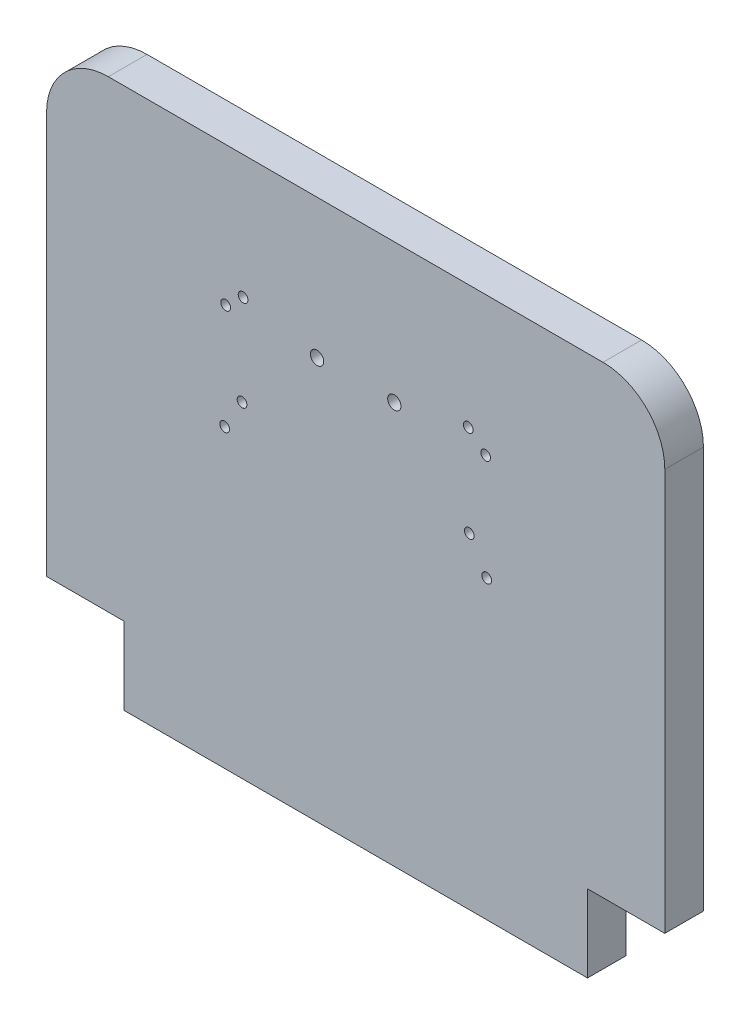
ISO-10303-21;
HEADER;
FILE_DESCRIPTION(('STEP AP214'),'2;1');
FILE_NAME('part.step','',(''),(''),'','','');
FILE_SCHEMA(('AUTOMOTIVE_DESIGN { 1 0 10303 214 1 1 1 1 }'));
ENDSEC;
DATA;
#1=APPLICATION_CONTEXT('core data for automotive mechanical design processes');
#2=APPLICATION_PROTOCOL_DEFINITION('international standard','automotive_design',2000,#1);
#3=PRODUCT_CONTEXT('',#1,'mechanical');
#4=PRODUCT('Part','Part','',(#3));
#5=PRODUCT_RELATED_PRODUCT_CATEGORY('part','',(#4));
#6=PRODUCT_DEFINITION_FORMATION('','',#4);
#7=PRODUCT_DEFINITION_CONTEXT('part definition',#1,'design');
#8=PRODUCT_DEFINITION('design','',#6,#7);
#9=PRODUCT_DEFINITION_SHAPE('','',#8);
#10=(LENGTH_UNIT() NAMED_UNIT(*) SI_UNIT(.MILLI.,.METRE.));
#11=(NAMED_UNIT(*) PLANE_ANGLE_UNIT() SI_UNIT($,.RADIAN.));
#12=(NAMED_UNIT(*) SI_UNIT($,.STERADIAN.) SOLID_ANGLE_UNIT());
#13=UNCERTAINTY_MEASURE_WITH_UNIT(LENGTH_MEASURE(1.E-05),#10,'distance_accuracy_value','');
#14=(GEOMETRIC_REPRESENTATION_CONTEXT(3) GLOBAL_UNCERTAINTY_ASSIGNED_CONTEXT((#13)) GLOBAL_UNIT_ASSIGNED_CONTEXT((#10,
#11,#12)) REPRESENTATION_CONTEXT('',''));
#15=CARTESIAN_POINT('',(0.,0.,0.));
#16=DIRECTION('',(0.,0.,1.));
#17=DIRECTION('',(1.,0.,0.));
#18=AXIS2_PLACEMENT_3D('',#15,#16,#17);
#19=CARTESIAN_POINT('',(0.,0.,6.35));
#20=DIRECTION('',(0.,0.,-1.));
#21=DIRECTION('',(-1.,0.,0.));
#22=AXIS2_PLACEMENT_3D('',#19,#20,#21);
#23=PLANE('',#22);
#24=DIRECTION('',(0.,1.,0.));
#25=VECTOR('',#24,1.);
#26=CARTESIAN_POINT('',(101.6,0.,6.35));
#27=LINE('',#26,#25);
#28=CARTESIAN_POINT('',(101.6,0.,6.35));
#29=VERTEX_POINT('',#28);
#30=CARTESIAN_POINT('',(101.6,66.04,6.35));
#31=VERTEX_POINT('',#30);
#32=EDGE_CURVE('E169',#29,#31,#27,.T.);
#33=ORIENTED_EDGE('',*,*,#32,.T.);
#34=CARTESIAN_POINT('',(91.44,66.04,6.35));
#35=DIRECTION('',(0.,0.,-1.));
#36=DIRECTION('',(-1.,0.,0.));
#37=AXIS2_PLACEMENT_3D('',#34,#35,#36);
#38=CIRCLE('',#37,10.16);
#39=CARTESIAN_POINT('',(91.44,76.2,6.35));
#40=VERTEX_POINT('',#39);
#41=EDGE_CURVE('E48',#31,#40,#38,.F.);
#42=ORIENTED_EDGE('',*,*,#41,.T.);
#43=DIRECTION('',(-1.,0.,0.));
#44=VECTOR('',#43,1.);
#45=CARTESIAN_POINT('',(0.,76.2,6.35));
#46=LINE('',#45,#44);
#47=CARTESIAN_POINT('',(10.16,76.2,6.35));
#48=VERTEX_POINT('',#47);
#49=EDGE_CURVE('E168',#40,#48,#46,.T.);
#50=ORIENTED_EDGE('',*,*,#49,.T.);
#51=CARTESIAN_POINT('',(10.16,66.04,6.35));
#52=DIRECTION('',(0.,0.,-1.));
#53=DIRECTION('',(-1.,0.,0.));
#54=AXIS2_PLACEMENT_3D('',#51,#52,#53);
#55=CIRCLE('',#54,10.16);
#56=CARTESIAN_POINT('',(0.,66.04,6.35));
#57=VERTEX_POINT('',#56);
#58=EDGE_CURVE('E55',#48,#57,#55,.F.);
#59=ORIENTED_EDGE('',*,*,#58,.T.);
#60=DIRECTION('',(0.,-1.,0.));
#61=VECTOR('',#60,1.);
#62=CARTESIAN_POINT('',(0.,0.,6.35));
#63=LINE('',#62,#61);
#64=CARTESIAN_POINT('',(0.,0.,6.35));
#65=VERTEX_POINT('',#64);
#66=EDGE_CURVE('E117',#57,#65,#63,.T.);
#67=ORIENTED_EDGE('',*,*,#66,.T.);
#68=DIRECTION('',(1.,0.,0.));
#69=VECTOR('',#68,1.);
#70=CARTESIAN_POINT('',(0.,0.,6.35));
#71=LINE('',#70,#69);
#72=CARTESIAN_POINT('',(12.7,0.,6.35));
#73=VERTEX_POINT('',#72);
#74=EDGE_CURVE('E120',#65,#73,#71,.T.);
#75=ORIENTED_EDGE('',*,*,#74,.T.);
#76=DIRECTION('',(0.,-1.,0.));
#77=VECTOR('',#76,1.);
#78=CARTESIAN_POINT('',(12.7,0.,6.35));
#79=LINE('',#78,#77);
#80=CARTESIAN_POINT('',(12.7,-12.7,6.35));
#81=VERTEX_POINT('',#80);
#82=EDGE_CURVE('E136',#73,#81,#79,.T.);
#83=ORIENTED_EDGE('',*,*,#82,.T.);
#84=DIRECTION('',(1.,0.,0.));
#85=VECTOR('',#84,1.);
#86=CARTESIAN_POINT('',(12.7,-12.7,6.35));
#87=LINE('',#86,#85);
#88=CARTESIAN_POINT('',(88.9,-12.7,6.35));
#89=VERTEX_POINT('',#88);
#90=EDGE_CURVE('E218',#81,#89,#87,.T.);
#91=ORIENTED_EDGE('',*,*,#90,.T.);
#92=DIRECTION('',(0.,1.,0.));
#93=VECTOR('',#92,1.);
#94=CARTESIAN_POINT('',(88.9,0.,6.35));
#95=LINE('',#94,#93);
#96=CARTESIAN_POINT('',(88.9,0.,6.35));
#97=VERTEX_POINT('',#96);
#98=EDGE_CURVE('E240',#89,#97,#95,.T.);
#99=ORIENTED_EDGE('',*,*,#98,.T.);
#100=DIRECTION('',(1.,0.,0.));
#101=VECTOR('',#100,1.);
#102=CARTESIAN_POINT('',(88.9,0.,6.35));
#103=LINE('',#102,#101);
#104=EDGE_CURVE('E237',#97,#29,#103,.T.);
#105=ORIENTED_EDGE('',*,*,#104,.T.);
#106=EDGE_LOOP('',(#33,#42,#50,#59,#67,#75,#83,#91,#99,#105));
#107=FACE_BOUND('',#106,.T.);
#108=CARTESIAN_POINT('',(44.45,53.34,6.35));
#109=DIRECTION('',(0.,0.,1.));
#110=DIRECTION('',(1.,0.,0.));
#111=AXIS2_PLACEMENT_3D('',#108,#109,#110);
#112=CIRCLE('',#111,1.0922);
#113=CARTESIAN_POINT('',(45.5422,53.34,6.35));
#114=VERTEX_POINT('',#113);
#115=EDGE_CURVE('E233',#114,#114,#112,.T.);
#116=ORIENTED_EDGE('',*,*,#115,.F.);
#117=EDGE_LOOP('',(#116));
#118=FACE_BOUND('',#117,.T.);
#119=CARTESIAN_POINT('',(57.15,53.34,6.35));
#120=DIRECTION('',(0.,0.,1.));
#121=DIRECTION('',(-1.,0.,0.));
#122=AXIS2_PLACEMENT_3D('',#119,#120,#121);
#123=CIRCLE('',#122,1.09220000000001);
#124=CARTESIAN_POINT('',(56.0578,53.34,6.35));
#125=VERTEX_POINT('',#124);
#126=EDGE_CURVE('E251',#125,#125,#123,.T.);
#127=ORIENTED_EDGE('',*,*,#126,.F.);
#128=EDGE_LOOP('',(#127));
#129=FACE_BOUND('',#128,.T.);
#130=CARTESIAN_POINT('',(32.3,55.88,6.35));
#131=DIRECTION('',(0.,0.,1.));
#132=DIRECTION('',(1.,0.,0.));
#133=AXIS2_PLACEMENT_3D('',#130,#131,#132);
#134=CIRCLE('',#133,0.799999999800007);
#135=CARTESIAN_POINT('',(33.0999999998,55.88,6.35));
#136=VERTEX_POINT('',#135);
#137=EDGE_CURVE('E259',#136,#136,#134,.T.);
#138=ORIENTED_EDGE('',*,*,#137,.F.);
#139=EDGE_LOOP('',(#138));
#140=FACE_BOUND('',#139,.T.);
#141=CARTESIAN_POINT('',(69.3,55.88,6.35));
#142=DIRECTION('',(0.,0.,1.));
#143=DIRECTION('',(-1.,0.,0.));
#144=AXIS2_PLACEMENT_3D('',#141,#142,#143);
#145=CIRCLE('',#144,0.79999999980002);
#146=CARTESIAN_POINT('',(68.5000000002,55.88,6.35));
#147=VERTEX_POINT('',#146);
#148=EDGE_CURVE('E267',#147,#147,#145,.T.);
#149=ORIENTED_EDGE('',*,*,#148,.F.);
#150=EDGE_LOOP('',(#149));
#151=FACE_BOUND('',#150,.T.);
#152=CARTESIAN_POINT('',(32.12531161866,40.88,6.35));
#153=DIRECTION('',(0.,0.,1.));
#154=DIRECTION('',(1.,0.,0.));
#155=AXIS2_PLACEMENT_3D('',#152,#153,#154);
#156=CIRCLE('',#155,0.799999999800007);
#157=CARTESIAN_POINT('',(32.92531161846,40.88,6.35));
#158=VERTEX_POINT('',#157);
#159=EDGE_CURVE('E275',#158,#158,#156,.T.);
#160=ORIENTED_EDGE('',*,*,#159,.F.);
#161=EDGE_LOOP('',(#160));
#162=FACE_BOUND('',#161,.T.);
#163=CARTESIAN_POINT('',(69.47468838134,40.88,6.35));
#164=DIRECTION('',(0.,0.,1.));
#165=DIRECTION('',(-1.,0.,0.));
#166=AXIS2_PLACEMENT_3D('',#163,#164,#165);
#167=CIRCLE('',#166,0.799999999800036);
#168=CARTESIAN_POINT('',(68.67468838154,40.88,6.35));
#169=VERTEX_POINT('',#168);
#170=EDGE_CURVE('E283',#169,#169,#167,.T.);
#171=ORIENTED_EDGE('',*,*,#170,.F.);
#172=EDGE_LOOP('',(#171));
#173=FACE_BOUND('',#172,.T.);
#174=CARTESIAN_POINT('',(29.4386,53.34,6.35));
#175=DIRECTION('',(0.,0.,1.));
#176=DIRECTION('',(1.,0.,0.));
#177=AXIS2_PLACEMENT_3D('',#174,#175,#176);
#178=CIRCLE('',#177,0.799999999800007);
#179=CARTESIAN_POINT('',(30.2385999998,53.34,6.35));
#180=VERTEX_POINT('',#179);
#181=EDGE_CURVE('E291',#180,#180,#178,.T.);
#182=ORIENTED_EDGE('',*,*,#181,.F.);
#183=EDGE_LOOP('',(#182));
#184=FACE_BOUND('',#183,.T.);
#185=CARTESIAN_POINT('',(29.26391161866,35.9540048,6.35));
#186=DIRECTION('',(0.,0.,1.));
#187=DIRECTION('',(1.,0.,0.));
#188=AXIS2_PLACEMENT_3D('',#185,#186,#187);
#189=CIRCLE('',#188,0.799999999800007);
#190=CARTESIAN_POINT('',(30.06391161846,35.9540048,6.35));
#191=VERTEX_POINT('',#190);
#192=EDGE_CURVE('E299',#191,#191,#189,.T.);
#193=ORIENTED_EDGE('',*,*,#192,.F.);
#194=EDGE_LOOP('',(#193));
#195=FACE_BOUND('',#194,.T.);
#196=CARTESIAN_POINT('',(72.33608838134,35.9540048,6.35));
#197=DIRECTION('',(0.,0.,1.));
#198=DIRECTION('',(-1.,0.,0.));
#199=AXIS2_PLACEMENT_3D('',#196,#197,#198);
#200=CIRCLE('',#199,0.799999999800007);
#201=CARTESIAN_POINT('',(71.53608838154,35.9540048,6.35));
#202=VERTEX_POINT('',#201);
#203=EDGE_CURVE('E307',#202,#202,#200,.T.);
#204=ORIENTED_EDGE('',*,*,#203,.F.);
#205=EDGE_LOOP('',(#204));
#206=FACE_BOUND('',#205,.T.);
#207=CARTESIAN_POINT('',(72.1614,53.34,6.35));
#208=DIRECTION('',(0.,0.,1.));
#209=DIRECTION('',(-1.,0.,0.));
#210=AXIS2_PLACEMENT_3D('',#207,#208,#209);
#211=CIRCLE('',#210,0.799999999800007);
#212=CARTESIAN_POINT('',(71.3614000002,53.34,6.35));
#213=VERTEX_POINT('',#212);
#214=EDGE_CURVE('E315',#213,#213,#211,.T.);
#215=ORIENTED_EDGE('',*,*,#214,.F.);
#216=EDGE_LOOP('',(#215));
#217=FACE_BOUND('',#216,.T.);
#218=ADVANCED_FACE('F39',(#107,#118,#129,#140,#151,#162,#173,#184,#195,#206,#217),#23,.F.);
#219=CARTESIAN_POINT('',(0.,0.,0.));
#220=DIRECTION('',(0.,0.,-1.));
#221=DIRECTION('',(-1.,0.,0.));
#222=AXIS2_PLACEMENT_3D('',#219,#220,#221);
#223=PLANE('',#222);
#224=CARTESIAN_POINT('',(72.33608838134,35.9540048,0.));
#225=DIRECTION('',(0.,0.,1.));
#226=DIRECTION('',(-1.,0.,0.));
#227=AXIS2_PLACEMENT_3D('',#224,#225,#226);
#228=CIRCLE('',#227,0.799999999800007);
#229=CARTESIAN_POINT('',(71.53608838154,35.9540048,0.));
#230=VERTEX_POINT('',#229);
#231=EDGE_CURVE('E311',#230,#230,#228,.T.);
#232=ORIENTED_EDGE('',*,*,#231,.T.);
#233=EDGE_LOOP('',(#232));
#234=FACE_BOUND('',#233,.T.);
#235=CARTESIAN_POINT('',(29.4386,53.34,0.));
#236=DIRECTION('',(0.,0.,1.));
#237=DIRECTION('',(1.,0.,0.));
#238=AXIS2_PLACEMENT_3D('',#235,#236,#237);
#239=CIRCLE('',#238,0.799999999800007);
#240=CARTESIAN_POINT('',(30.2385999998,53.34,0.));
#241=VERTEX_POINT('',#240);
#242=EDGE_CURVE('E295',#241,#241,#239,.T.);
#243=ORIENTED_EDGE('',*,*,#242,.T.);
#244=EDGE_LOOP('',(#243));
#245=FACE_BOUND('',#244,.T.);
#246=CARTESIAN_POINT('',(32.12531161866,40.88,0.));
#247=DIRECTION('',(0.,0.,1.));
#248=DIRECTION('',(1.,0.,0.));
#249=AXIS2_PLACEMENT_3D('',#246,#247,#248);
#250=CIRCLE('',#249,0.799999999800007);
#251=CARTESIAN_POINT('',(32.92531161846,40.88,0.));
#252=VERTEX_POINT('',#251);
#253=EDGE_CURVE('E279',#252,#252,#250,.T.);
#254=ORIENTED_EDGE('',*,*,#253,.T.);
#255=EDGE_LOOP('',(#254));
#256=FACE_BOUND('',#255,.T.);
#257=CARTESIAN_POINT('',(32.3,55.88,0.));
#258=DIRECTION('',(0.,0.,1.));
#259=DIRECTION('',(1.,0.,0.));
#260=AXIS2_PLACEMENT_3D('',#257,#258,#259);
#261=CIRCLE('',#260,0.799999999800007);
#262=CARTESIAN_POINT('',(33.0999999998,55.88,0.));
#263=VERTEX_POINT('',#262);
#264=EDGE_CURVE('E263',#263,#263,#261,.T.);
#265=ORIENTED_EDGE('',*,*,#264,.T.);
#266=EDGE_LOOP('',(#265));
#267=FACE_BOUND('',#266,.T.);
#268=CARTESIAN_POINT('',(44.45,53.34,0.));
#269=DIRECTION('',(0.,0.,1.));
#270=DIRECTION('',(1.,0.,0.));
#271=AXIS2_PLACEMENT_3D('',#268,#269,#270);
#272=CIRCLE('',#271,1.0922);
#273=CARTESIAN_POINT('',(45.5422,53.34,0.));
#274=VERTEX_POINT('',#273);
#275=EDGE_CURVE('E247',#274,#274,#272,.T.);
#276=ORIENTED_EDGE('',*,*,#275,.T.);
#277=EDGE_LOOP('',(#276));
#278=FACE_BOUND('',#277,.T.);
#279=DIRECTION('',(-1.,0.,0.));
#280=VECTOR('',#279,1.);
#281=CARTESIAN_POINT('',(0.,76.2,0.));
#282=LINE('',#281,#280);
#283=CARTESIAN_POINT('',(91.44,76.2,0.));
#284=VERTEX_POINT('',#283);
#285=CARTESIAN_POINT('',(10.16,76.2,0.));
#286=VERTEX_POINT('',#285);
#287=EDGE_CURVE('E126',#284,#286,#282,.T.);
#288=ORIENTED_EDGE('',*,*,#287,.F.);
#289=CARTESIAN_POINT('',(91.44,66.04,0.));
#290=DIRECTION('',(0.,0.,-1.));
#291=DIRECTION('',(-1.,0.,0.));
#292=AXIS2_PLACEMENT_3D('',#289,#290,#291);
#293=CIRCLE('',#292,10.16);
#294=CARTESIAN_POINT('',(101.6,66.04,0.));
#295=VERTEX_POINT('',#294);
#296=EDGE_CURVE('E159',#284,#295,#293,.T.);
#297=ORIENTED_EDGE('',*,*,#296,.T.);
#298=DIRECTION('',(0.,1.,0.));
#299=VECTOR('',#298,1.);
#300=CARTESIAN_POINT('',(101.6,0.,0.));
#301=LINE('',#300,#299);
#302=CARTESIAN_POINT('',(101.6,0.,0.));
#303=VERTEX_POINT('',#302);
#304=EDGE_CURVE('E186',#303,#295,#301,.T.);
#305=ORIENTED_EDGE('',*,*,#304,.F.);
#306=DIRECTION('',(1.,0.,0.));
#307=VECTOR('',#306,1.);
#308=CARTESIAN_POINT('',(88.9,0.,0.));
#309=LINE('',#308,#307);
#310=CARTESIAN_POINT('',(88.9,0.,0.));
#311=VERTEX_POINT('',#310);
#312=EDGE_CURVE('E191',#311,#303,#309,.T.);
#313=ORIENTED_EDGE('',*,*,#312,.F.);
#314=DIRECTION('',(0.,1.,0.));
#315=VECTOR('',#314,1.);
#316=CARTESIAN_POINT('',(88.9,0.,0.));
#317=LINE('',#316,#315);
#318=CARTESIAN_POINT('',(88.9,-12.7,0.));
#319=VERTEX_POINT('',#318);
#320=EDGE_CURVE('E196',#319,#311,#317,.T.);
#321=ORIENTED_EDGE('',*,*,#320,.F.);
#322=DIRECTION('',(1.,0.,0.));
#323=VECTOR('',#322,1.);
#324=CARTESIAN_POINT('',(12.7,-12.7,0.));
#325=LINE('',#324,#323);
#326=CARTESIAN_POINT('',(12.7,-12.7,0.));
#327=VERTEX_POINT('',#326);
#328=EDGE_CURVE('E217',#327,#319,#325,.T.);
#329=ORIENTED_EDGE('',*,*,#328,.F.);
#330=DIRECTION('',(0.,-1.,0.));
#331=VECTOR('',#330,1.);
#332=CARTESIAN_POINT('',(12.7,0.,0.));
#333=LINE('',#332,#331);
#334=CARTESIAN_POINT('',(12.7,0.,0.));
#335=VERTEX_POINT('',#334);
#336=EDGE_CURVE('E222',#335,#327,#333,.T.);
#337=ORIENTED_EDGE('',*,*,#336,.F.);
#338=DIRECTION('',(1.,0.,0.));
#339=VECTOR('',#338,1.);
#340=CARTESIAN_POINT('',(0.,0.,0.));
#341=LINE('',#340,#339);
#342=CARTESIAN_POINT('',(0.,0.,0.));
#343=VERTEX_POINT('',#342);
#344=EDGE_CURVE('E227',#343,#335,#341,.T.);
#345=ORIENTED_EDGE('',*,*,#344,.F.);
#346=DIRECTION('',(0.,-1.,0.));
#347=VECTOR('',#346,1.);
#348=CARTESIAN_POINT('',(0.,0.,0.));
#349=LINE('',#348,#347);
#350=CARTESIAN_POINT('',(0.,66.04,0.));
#351=VERTEX_POINT('',#350);
#352=EDGE_CURVE('E140',#351,#343,#349,.T.);
#353=ORIENTED_EDGE('',*,*,#352,.F.);
#354=CARTESIAN_POINT('',(10.16,66.04,0.));
#355=DIRECTION('',(0.,0.,-1.));
#356=DIRECTION('',(-1.,0.,0.));
#357=AXIS2_PLACEMENT_3D('',#354,#355,#356);
#358=CIRCLE('',#357,10.16);
#359=EDGE_CURVE('E156',#351,#286,#358,.T.);
#360=ORIENTED_EDGE('',*,*,#359,.T.);
#361=EDGE_LOOP('',(#288,#297,#305,#313,#321,#329,#337,#345,#353,#360));
#362=FACE_BOUND('',#361,.T.);
#363=CARTESIAN_POINT('',(57.15,53.34,0.));
#364=DIRECTION('',(0.,0.,1.));
#365=DIRECTION('',(-1.,0.,0.));
#366=AXIS2_PLACEMENT_3D('',#363,#364,#365);
#367=CIRCLE('',#366,1.09220000000001);
#368=CARTESIAN_POINT('',(56.0578,53.34,0.));
#369=VERTEX_POINT('',#368);
#370=EDGE_CURVE('E255',#369,#369,#367,.T.);
#371=ORIENTED_EDGE('',*,*,#370,.T.);
#372=EDGE_LOOP('',(#371));
#373=FACE_BOUND('',#372,.T.);
#374=CARTESIAN_POINT('',(69.3,55.88,0.));
#375=DIRECTION('',(0.,0.,1.));
#376=DIRECTION('',(-1.,0.,0.));
#377=AXIS2_PLACEMENT_3D('',#374,#375,#376);
#378=CIRCLE('',#377,0.79999999980002);
#379=CARTESIAN_POINT('',(68.5000000002,55.88,0.));
#380=VERTEX_POINT('',#379);
#381=EDGE_CURVE('E271',#380,#380,#378,.T.);
#382=ORIENTED_EDGE('',*,*,#381,.T.);
#383=EDGE_LOOP('',(#382));
#384=FACE_BOUND('',#383,.T.);
#385=CARTESIAN_POINT('',(69.47468838134,40.88,0.));
#386=DIRECTION('',(0.,0.,1.));
#387=DIRECTION('',(-1.,0.,0.));
#388=AXIS2_PLACEMENT_3D('',#385,#386,#387);
#389=CIRCLE('',#388,0.799999999800036);
#390=CARTESIAN_POINT('',(68.67468838154,40.88,0.));
#391=VERTEX_POINT('',#390);
#392=EDGE_CURVE('E287',#391,#391,#389,.T.);
#393=ORIENTED_EDGE('',*,*,#392,.T.);
#394=EDGE_LOOP('',(#393));
#395=FACE_BOUND('',#394,.T.);
#396=CARTESIAN_POINT('',(29.26391161866,35.9540048,0.));
#397=DIRECTION('',(0.,0.,1.));
#398=DIRECTION('',(1.,0.,0.));
#399=AXIS2_PLACEMENT_3D('',#396,#397,#398);
#400=CIRCLE('',#399,0.799999999800007);
#401=CARTESIAN_POINT('',(30.06391161846,35.9540048,0.));
#402=VERTEX_POINT('',#401);
#403=EDGE_CURVE('E303',#402,#402,#400,.T.);
#404=ORIENTED_EDGE('',*,*,#403,.T.);
#405=EDGE_LOOP('',(#404));
#406=FACE_BOUND('',#405,.T.);
#407=CARTESIAN_POINT('',(72.1614,53.34,0.));
#408=DIRECTION('',(0.,0.,1.));
#409=DIRECTION('',(-1.,0.,0.));
#410=AXIS2_PLACEMENT_3D('',#407,#408,#409);
#411=CIRCLE('',#410,0.799999999800007);
#412=CARTESIAN_POINT('',(71.3614000002,53.34,0.));
#413=VERTEX_POINT('',#412);
#414=EDGE_CURVE('E319',#413,#413,#411,.T.);
#415=ORIENTED_EDGE('',*,*,#414,.T.);
#416=EDGE_LOOP('',(#415));
#417=FACE_BOUND('',#416,.T.);
#418=ADVANCED_FACE('F183',(#234,#245,#256,#267,#278,#362,#373,#384,#395,#406,#417),#223,.T.);
#419=CARTESIAN_POINT('',(0.,0.,6.35));
#420=DIRECTION('',(1.,0.,0.));
#421=DIRECTION('',(0.,0.,-1.));
#422=AXIS2_PLACEMENT_3D('',#419,#420,#421);
#423=PLANE('',#422);
#424=ORIENTED_EDGE('',*,*,#66,.F.);
#425=DIRECTION('',(0.,0.,-1.));
#426=VECTOR('',#425,1.);
#427=CARTESIAN_POINT('',(0.,66.04,6.35));
#428=LINE('',#427,#426);
#429=EDGE_CURVE('E11',#57,#351,#428,.T.);
#430=ORIENTED_EDGE('',*,*,#429,.T.);
#431=ORIENTED_EDGE('',*,*,#352,.T.);
#432=DIRECTION('',(0.,0.,-1.));
#433=VECTOR('',#432,1.);
#434=CARTESIAN_POINT('',(0.,0.,6.35));
#435=LINE('',#434,#433);
#436=EDGE_CURVE('E131',#65,#343,#435,.T.);
#437=ORIENTED_EDGE('',*,*,#436,.F.);
#438=EDGE_LOOP('',(#424,#430,#431,#437));
#439=FACE_BOUND('',#438,.T.);
#440=ADVANCED_FACE('F138',(#439),#423,.F.);
#441=CARTESIAN_POINT('',(0.,0.,6.35));
#442=DIRECTION('',(0.,1.,0.));
#443=DIRECTION('',(0.,0.,1.));
#444=AXIS2_PLACEMENT_3D('',#441,#442,#443);
#445=PLANE('',#444);
#446=ORIENTED_EDGE('',*,*,#344,.T.);
#447=DIRECTION('',(0.,0.,-1.));
#448=VECTOR('',#447,1.);
#449=CARTESIAN_POINT('',(12.7,0.,6.35));
#450=LINE('',#449,#448);
#451=EDGE_CURVE('E133',#73,#335,#450,.T.);
#452=ORIENTED_EDGE('',*,*,#451,.F.);
#453=ORIENTED_EDGE('',*,*,#74,.F.);
#454=ORIENTED_EDGE('',*,*,#436,.T.);
#455=EDGE_LOOP('',(#446,#452,#453,#454));
#456=FACE_BOUND('',#455,.T.);
#457=ADVANCED_FACE('F130',(#456),#445,.F.);
#458=CARTESIAN_POINT('',(12.7,0.,6.35));
#459=DIRECTION('',(1.,0.,0.));
#460=DIRECTION('',(0.,1.,0.));
#461=AXIS2_PLACEMENT_3D('',#458,#459,#460);
#462=PLANE('',#461);
#463=ORIENTED_EDGE('',*,*,#336,.T.);
#464=DIRECTION('',(0.,0.,-1.));
#465=VECTOR('',#464,1.);
#466=CARTESIAN_POINT('',(12.7,-12.7,6.35));
#467=LINE('',#466,#465);
#468=EDGE_CURVE('E149',#81,#327,#467,.T.);
#469=ORIENTED_EDGE('',*,*,#468,.F.);
#470=ORIENTED_EDGE('',*,*,#82,.F.);
#471=ORIENTED_EDGE('',*,*,#451,.T.);
#472=EDGE_LOOP('',(#463,#469,#470,#471));
#473=FACE_BOUND('',#472,.T.);
#474=ADVANCED_FACE('F355',(#473),#462,.F.);
#475=CARTESIAN_POINT('',(12.7,-12.7,6.35));
#476=DIRECTION('',(0.,1.,0.));
#477=DIRECTION('',(-1.,0.,0.));
#478=AXIS2_PLACEMENT_3D('',#475,#476,#477);
#479=PLANE('',#478);
#480=ORIENTED_EDGE('',*,*,#328,.T.);
#481=DIRECTION('',(0.,0.,-1.));
#482=VECTOR('',#481,1.);
#483=CARTESIAN_POINT('',(88.9,-12.7,6.35));
#484=LINE('',#483,#482);
#485=EDGE_CURVE('E206',#89,#319,#484,.T.);
#486=ORIENTED_EDGE('',*,*,#485,.F.);
#487=ORIENTED_EDGE('',*,*,#90,.F.);
#488=ORIENTED_EDGE('',*,*,#468,.T.);
#489=EDGE_LOOP('',(#480,#486,#487,#488));
#490=FACE_BOUND('',#489,.T.);
#491=ADVANCED_FACE('F215',(#490),#479,.F.);
#492=CARTESIAN_POINT('',(88.9,0.,6.35));
#493=DIRECTION('',(-1.,0.,0.));
#494=DIRECTION('',(0.,0.,1.));
#495=AXIS2_PLACEMENT_3D('',#492,#493,#494);
#496=PLANE('',#495);
#497=ORIENTED_EDGE('',*,*,#320,.T.);
#498=DIRECTION('',(0.,0.,-1.));
#499=VECTOR('',#498,1.);
#500=CARTESIAN_POINT('',(88.9,0.,6.35));
#501=LINE('',#500,#499);
#502=EDGE_CURVE('E202',#97,#311,#501,.T.);
#503=ORIENTED_EDGE('',*,*,#502,.F.);
#504=ORIENTED_EDGE('',*,*,#98,.F.);
#505=ORIENTED_EDGE('',*,*,#485,.T.);
#506=EDGE_LOOP('',(#497,#503,#504,#505));
#507=FACE_BOUND('',#506,.T.);
#508=ADVANCED_FACE('F348',(#507),#496,.F.);
#509=CARTESIAN_POINT('',(88.9,0.,6.35));
#510=DIRECTION('',(0.,1.,0.));
#511=DIRECTION('',(0.,0.,1.));
#512=AXIS2_PLACEMENT_3D('',#509,#510,#511);
#513=PLANE('',#512);
#514=ORIENTED_EDGE('',*,*,#312,.T.);
#515=DIRECTION('',(0.,0.,-1.));
#516=VECTOR('',#515,1.);
#517=CARTESIAN_POINT('',(101.6,0.,6.35));
#518=LINE('',#517,#516);
#519=EDGE_CURVE('E178',#29,#303,#518,.T.);
#520=ORIENTED_EDGE('',*,*,#519,.F.);
#521=ORIENTED_EDGE('',*,*,#104,.F.);
#522=ORIENTED_EDGE('',*,*,#502,.T.);
#523=EDGE_LOOP('',(#514,#520,#521,#522));
#524=FACE_BOUND('',#523,.T.);
#525=ADVANCED_FACE('F345',(#524),#513,.F.);
#526=CARTESIAN_POINT('',(101.6,0.,6.35));
#527=DIRECTION('',(-1.,0.,0.));
#528=DIRECTION('',(0.,0.,1.));
#529=AXIS2_PLACEMENT_3D('',#526,#527,#528);
#530=PLANE('',#529);
#531=ORIENTED_EDGE('',*,*,#304,.T.);
#532=DIRECTION('',(0.,0.,-1.));
#533=VECTOR('',#532,1.);
#534=CARTESIAN_POINT('',(101.6,66.04,6.35));
#535=LINE('',#534,#533);
#536=EDGE_CURVE('E63',#295,#31,#535,.F.);
#537=ORIENTED_EDGE('',*,*,#536,.T.);
#538=ORIENTED_EDGE('',*,*,#32,.F.);
#539=ORIENTED_EDGE('',*,*,#519,.T.);
#540=EDGE_LOOP('',(#531,#537,#538,#539));
#541=FACE_BOUND('',#540,.T.);
#542=ADVANCED_FACE('F188',(#541),#530,.F.);
#543=CARTESIAN_POINT('',(0.,76.2,6.35));
#544=DIRECTION('',(0.,-1.,0.));
#545=DIRECTION('',(0.,0.,-1.));
#546=AXIS2_PLACEMENT_3D('',#543,#544,#545);
#547=PLANE('',#546);
#548=ORIENTED_EDGE('',*,*,#49,.F.);
#549=DIRECTION('',(0.,0.,-1.));
#550=VECTOR('',#549,1.);
#551=CARTESIAN_POINT('',(91.44,76.2,6.35));
#552=LINE('',#551,#550);
#553=EDGE_CURVE('E147',#40,#284,#552,.T.);
#554=ORIENTED_EDGE('',*,*,#553,.T.);
#555=ORIENTED_EDGE('',*,*,#287,.T.);
#556=DIRECTION('',(0.,0.,-1.));
#557=VECTOR('',#556,1.);
#558=CARTESIAN_POINT('',(10.16,76.2,6.35));
#559=LINE('',#558,#557);
#560=EDGE_CURVE('E143',#286,#48,#559,.F.);
#561=ORIENTED_EDGE('',*,*,#560,.T.);
#562=EDGE_LOOP('',(#548,#554,#555,#561));
#563=FACE_BOUND('',#562,.T.);
#564=ADVANCED_FACE('F173',(#563),#547,.F.);
#565=CARTESIAN_POINT('',(44.45,53.34,6.35));
#566=DIRECTION('',(0.,0.,-1.));
#567=DIRECTION('',(-1.,0.,0.));
#568=AXIS2_PLACEMENT_3D('',#565,#566,#567);
#569=CYLINDRICAL_SURFACE('',#568,1.0922);
#570=ORIENTED_EDGE('',*,*,#115,.T.);
#571=EDGE_LOOP('',(#570));
#572=FACE_BOUND('',#571,.T.);
#573=ORIENTED_EDGE('',*,*,#275,.F.);
#574=EDGE_LOOP('',(#573));
#575=FACE_BOUND('',#574,.T.);
#576=ADVANCED_FACE('F338',(#572,#575),#569,.F.);
#577=CARTESIAN_POINT('',(57.15,53.34,6.35));
#578=DIRECTION('',(0.,0.,-1.));
#579=DIRECTION('',(-1.,0.,0.));
#580=AXIS2_PLACEMENT_3D('',#577,#578,#579);
#581=CYLINDRICAL_SURFACE('',#580,1.09220000000001);
#582=ORIENTED_EDGE('',*,*,#126,.T.);
#583=EDGE_LOOP('',(#582));
#584=FACE_BOUND('',#583,.T.);
#585=ORIENTED_EDGE('',*,*,#370,.F.);
#586=EDGE_LOOP('',(#585));
#587=FACE_BOUND('',#586,.T.);
#588=ADVANCED_FACE('F397',(#584,#587),#581,.F.);
#589=CARTESIAN_POINT('',(32.3,55.88,6.35));
#590=DIRECTION('',(0.,0.,-1.));
#591=DIRECTION('',(-1.,0.,0.));
#592=AXIS2_PLACEMENT_3D('',#589,#590,#591);
#593=CYLINDRICAL_SURFACE('',#592,0.799999999800007);
#594=ORIENTED_EDGE('',*,*,#137,.T.);
#595=EDGE_LOOP('',(#594));
#596=FACE_BOUND('',#595,.T.);
#597=ORIENTED_EDGE('',*,*,#264,.F.);
#598=EDGE_LOOP('',(#597));
#599=FACE_BOUND('',#598,.T.);
#600=ADVANCED_FACE('F394',(#596,#599),#593,.F.);
#601=CARTESIAN_POINT('',(69.3,55.88,6.35));
#602=DIRECTION('',(0.,0.,-1.));
#603=DIRECTION('',(-1.,0.,0.));
#604=AXIS2_PLACEMENT_3D('',#601,#602,#603);
#605=CYLINDRICAL_SURFACE('',#604,0.79999999980002);
#606=ORIENTED_EDGE('',*,*,#148,.T.);
#607=EDGE_LOOP('',(#606));
#608=FACE_BOUND('',#607,.T.);
#609=ORIENTED_EDGE('',*,*,#381,.F.);
#610=EDGE_LOOP('',(#609));
#611=FACE_BOUND('',#610,.T.);
#612=ADVANCED_FACE('F390',(#608,#611),#605,.F.);
#613=CARTESIAN_POINT('',(32.12531161866,40.88,6.35));
#614=DIRECTION('',(0.,0.,-1.));
#615=DIRECTION('',(-1.,0.,0.));
#616=AXIS2_PLACEMENT_3D('',#613,#614,#615);
#617=CYLINDRICAL_SURFACE('',#616,0.799999999800007);
#618=ORIENTED_EDGE('',*,*,#159,.T.);
#619=EDGE_LOOP('',(#618));
#620=FACE_BOUND('',#619,.T.);
#621=ORIENTED_EDGE('',*,*,#253,.F.);
#622=EDGE_LOOP('',(#621));
#623=FACE_BOUND('',#622,.T.);
#624=ADVANCED_FACE('F386',(#620,#623),#617,.F.);
#625=CARTESIAN_POINT('',(69.47468838134,40.88,6.35));
#626=DIRECTION('',(0.,0.,-1.));
#627=DIRECTION('',(-1.,0.,0.));
#628=AXIS2_PLACEMENT_3D('',#625,#626,#627);
#629=CYLINDRICAL_SURFACE('',#628,0.799999999800036);
#630=ORIENTED_EDGE('',*,*,#170,.T.);
#631=EDGE_LOOP('',(#630));
#632=FACE_BOUND('',#631,.T.);
#633=ORIENTED_EDGE('',*,*,#392,.F.);
#634=EDGE_LOOP('',(#633));
#635=FACE_BOUND('',#634,.T.);
#636=ADVANCED_FACE('F382',(#632,#635),#629,.F.);
#637=CARTESIAN_POINT('',(29.4386,53.34,6.35));
#638=DIRECTION('',(0.,0.,-1.));
#639=DIRECTION('',(-1.,0.,0.));
#640=AXIS2_PLACEMENT_3D('',#637,#638,#639);
#641=CYLINDRICAL_SURFACE('',#640,0.799999999800007);
#642=ORIENTED_EDGE('',*,*,#181,.T.);
#643=EDGE_LOOP('',(#642));
#644=FACE_BOUND('',#643,.T.);
#645=ORIENTED_EDGE('',*,*,#242,.F.);
#646=EDGE_LOOP('',(#645));
#647=FACE_BOUND('',#646,.T.);
#648=ADVANCED_FACE('F378',(#644,#647),#641,.F.);
#649=CARTESIAN_POINT('',(29.26391161866,35.9540048,6.35));
#650=DIRECTION('',(0.,0.,-1.));
#651=DIRECTION('',(-1.,0.,0.));
#652=AXIS2_PLACEMENT_3D('',#649,#650,#651);
#653=CYLINDRICAL_SURFACE('',#652,0.799999999800007);
#654=ORIENTED_EDGE('',*,*,#192,.T.);
#655=EDGE_LOOP('',(#654));
#656=FACE_BOUND('',#655,.T.);
#657=ORIENTED_EDGE('',*,*,#403,.F.);
#658=EDGE_LOOP('',(#657));
#659=FACE_BOUND('',#658,.T.);
#660=ADVANCED_FACE('F372',(#656,#659),#653,.F.);
#661=CARTESIAN_POINT('',(72.33608838134,35.9540048,6.35));
#662=DIRECTION('',(0.,0.,-1.));
#663=DIRECTION('',(-1.,0.,0.));
#664=AXIS2_PLACEMENT_3D('',#661,#662,#663);
#665=CYLINDRICAL_SURFACE('',#664,0.799999999800007);
#666=ORIENTED_EDGE('',*,*,#203,.T.);
#667=EDGE_LOOP('',(#666));
#668=FACE_BOUND('',#667,.T.);
#669=ORIENTED_EDGE('',*,*,#231,.F.);
#670=EDGE_LOOP('',(#669));
#671=FACE_BOUND('',#670,.T.);
#672=ADVANCED_FACE('F367',(#668,#671),#665,.F.);
#673=CARTESIAN_POINT('',(72.1614,53.34,6.35));
#674=DIRECTION('',(0.,0.,-1.));
#675=DIRECTION('',(-1.,0.,0.));
#676=AXIS2_PLACEMENT_3D('',#673,#674,#675);
#677=CYLINDRICAL_SURFACE('',#676,0.799999999800007);
#678=ORIENTED_EDGE('',*,*,#214,.T.);
#679=EDGE_LOOP('',(#678));
#680=FACE_BOUND('',#679,.T.);
#681=ORIENTED_EDGE('',*,*,#414,.F.);
#682=EDGE_LOOP('',(#681));
#683=FACE_BOUND('',#682,.T.);
#684=ADVANCED_FACE('F327',(#680,#683),#677,.F.);
#685=CARTESIAN_POINT('',(91.44,66.04,6.35));
#686=DIRECTION('',(0.,0.,-1.));
#687=DIRECTION('',(-1.,0.,0.));
#688=AXIS2_PLACEMENT_3D('',#685,#686,#687);
#689=CYLINDRICAL_SURFACE('',#688,10.16);
#690=ORIENTED_EDGE('',*,*,#41,.F.);
#691=ORIENTED_EDGE('',*,*,#536,.F.);
#692=ORIENTED_EDGE('',*,*,#296,.F.);
#693=ORIENTED_EDGE('',*,*,#553,.F.);
#694=EDGE_LOOP('',(#690,#691,#692,#693));
#695=FACE_BOUND('',#694,.T.);
#696=ADVANCED_FACE('F180',(#695),#689,.T.);
#697=CARTESIAN_POINT('',(10.16,66.04,6.35));
#698=DIRECTION('',(0.,0.,-1.));
#699=DIRECTION('',(-1.,0.,0.));
#700=AXIS2_PLACEMENT_3D('',#697,#698,#699);
#701=CYLINDRICAL_SURFACE('',#700,10.16);
#702=ORIENTED_EDGE('',*,*,#58,.F.);
#703=ORIENTED_EDGE('',*,*,#560,.F.);
#704=ORIENTED_EDGE('',*,*,#359,.F.);
#705=ORIENTED_EDGE('',*,*,#429,.F.);
#706=EDGE_LOOP('',(#702,#703,#704,#705));
#707=FACE_BOUND('',#706,.T.);
#708=ADVANCED_FACE('F41',(#707),#701,.T.);
#709=CLOSED_SHELL('',(#218,#418,#440,#457,#474,#491,#508,#525,#542,#564,#576,#588,#600,#612,
#624,#636,#648,#660,#672,#684,#696,#708));
#710=MANIFOLD_SOLID_BREP('B2',#709);
#711=ADVANCED_BREP_SHAPE_REPRESENTATION('',(#18,#710),#14);
#712=SHAPE_DEFINITION_REPRESENTATION(#9,#711);
ENDSEC;
END-ISO-10303-21;
